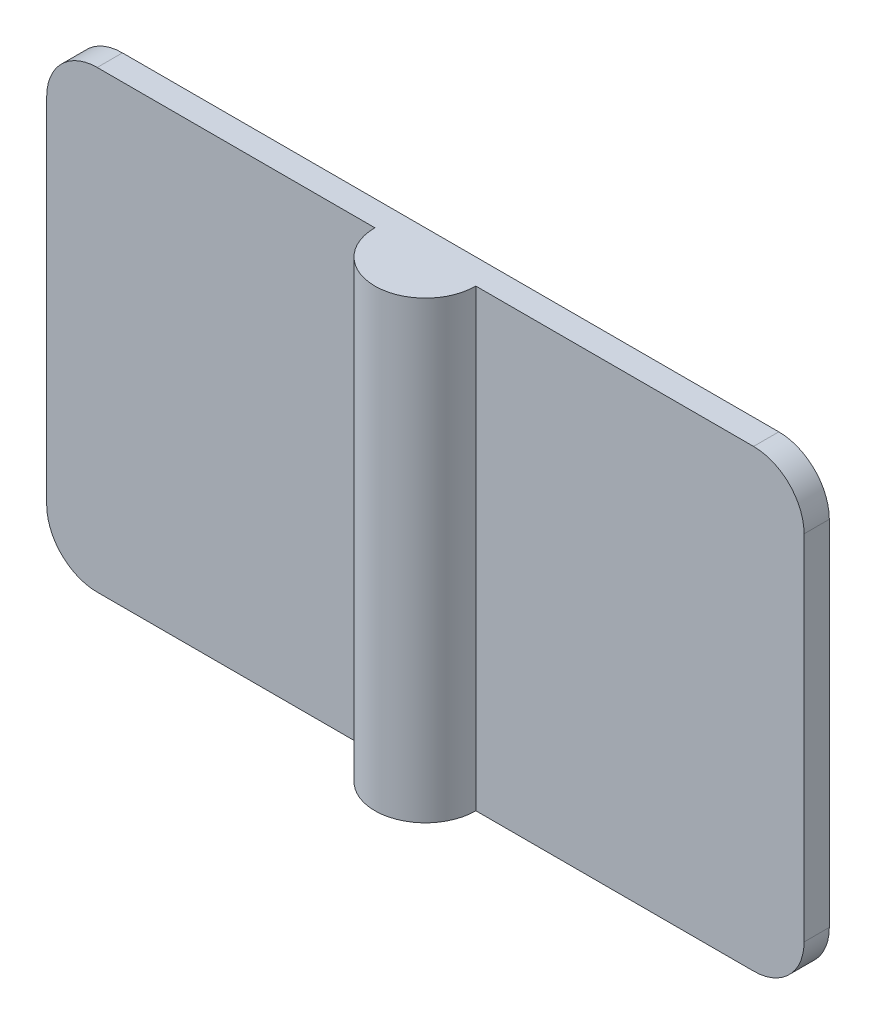
ISO-10303-21;
HEADER;
FILE_DESCRIPTION(('STEP AP214'),'2;1');
FILE_NAME('part.step','',(''),(''),'','','');
FILE_SCHEMA(('AUTOMOTIVE_DESIGN { 1 0 10303 214 1 1 1 1 }'));
ENDSEC;
DATA;
#1=APPLICATION_CONTEXT('core data for automotive mechanical design processes');
#2=APPLICATION_PROTOCOL_DEFINITION('international standard','automotive_design',2000,#1);
#3=PRODUCT_CONTEXT('',#1,'mechanical');
#4=PRODUCT('Part','Part','',(#3));
#5=PRODUCT_RELATED_PRODUCT_CATEGORY('part','',(#4));
#6=PRODUCT_DEFINITION_FORMATION('','',#4);
#7=PRODUCT_DEFINITION_CONTEXT('part definition',#1,'design');
#8=PRODUCT_DEFINITION('design','',#6,#7);
#9=PRODUCT_DEFINITION_SHAPE('','',#8);
#10=(LENGTH_UNIT() NAMED_UNIT(*) SI_UNIT(.MILLI.,.METRE.));
#11=(NAMED_UNIT(*) PLANE_ANGLE_UNIT() SI_UNIT($,.RADIAN.));
#12=(NAMED_UNIT(*) SI_UNIT($,.STERADIAN.) SOLID_ANGLE_UNIT());
#13=UNCERTAINTY_MEASURE_WITH_UNIT(LENGTH_MEASURE(1.E-05),#10,'distance_accuracy_value','');
#14=(GEOMETRIC_REPRESENTATION_CONTEXT(3) GLOBAL_UNCERTAINTY_ASSIGNED_CONTEXT((#13)) GLOBAL_UNIT_ASSIGNED_CONTEXT((#10,
#11,#12)) REPRESENTATION_CONTEXT('',''));
#15=CARTESIAN_POINT('',(0.,0.,0.));
#16=DIRECTION('',(0.,0.,1.));
#17=DIRECTION('',(1.,0.,0.));
#18=AXIS2_PLACEMENT_3D('',#15,#16,#17);
#19=CARTESIAN_POINT('',(0.,0.,1.));
#20=DIRECTION('',(0.,0.,1.));
#21=DIRECTION('',(1.,0.,0.));
#22=AXIS2_PLACEMENT_3D('',#19,#20,#21);
#23=PLANE('',#22);
#24=DIRECTION('',(1.,0.,0.));
#25=VECTOR('',#24,1.);
#26=CARTESIAN_POINT('',(-454.730210404928,-60.9999999999998,1.));
#27=LINE('',#26,#25);
#28=CARTESIAN_POINT('',(-437.730210404928,-60.9999999999998,1.));
#29=VERTEX_POINT('',#28);
#30=CARTESIAN_POINT('',(-426.730210404928,-60.9999999999998,1.));
#31=VERTEX_POINT('',#30);
#32=EDGE_CURVE('E144',#29,#31,#27,.T.);
#33=ORIENTED_EDGE('',*,*,#32,.T.);
#34=CARTESIAN_POINT('',(-426.730210404928,-58.9999999999998,1.));
#35=DIRECTION('',(0.,0.,1.));
#36=DIRECTION('',(1.,0.,0.));
#37=AXIS2_PLACEMENT_3D('',#34,#35,#36);
#38=CIRCLE('',#37,2.);
#39=CARTESIAN_POINT('',(-424.730210404928,-58.9999999999998,1.));
#40=VERTEX_POINT('',#39);
#41=EDGE_CURVE('E11',#31,#40,#38,.T.);
#42=ORIENTED_EDGE('',*,*,#41,.T.);
#43=DIRECTION('',(0.,1.,0.));
#44=VECTOR('',#43,1.);
#45=CARTESIAN_POINT('',(-424.730210404928,-42.9999999999998,1.));
#46=LINE('',#45,#44);
#47=CARTESIAN_POINT('',(-424.730210404928,-44.9999999999998,1.));
#48=VERTEX_POINT('',#47);
#49=EDGE_CURVE('E121',#40,#48,#46,.T.);
#50=ORIENTED_EDGE('',*,*,#49,.T.);
#51=CARTESIAN_POINT('',(-426.730210404928,-44.9999999999998,1.));
#52=DIRECTION('',(0.,0.,1.));
#53=DIRECTION('',(1.,0.,0.));
#54=AXIS2_PLACEMENT_3D('',#51,#52,#53);
#55=CIRCLE('',#54,2.);
#56=CARTESIAN_POINT('',(-426.730210404928,-42.9999999999998,1.));
#57=VERTEX_POINT('',#56);
#58=EDGE_CURVE('E40',#48,#57,#55,.T.);
#59=ORIENTED_EDGE('',*,*,#58,.T.);
#60=DIRECTION('',(-1.,0.,0.));
#61=VECTOR('',#60,1.);
#62=CARTESIAN_POINT('',(-454.730210404928,-42.9999999999998,1.));
#63=LINE('',#62,#61);
#64=CARTESIAN_POINT('',(-437.730210404928,-42.9999999999998,1.));
#65=VERTEX_POINT('',#64);
#66=EDGE_CURVE('E120',#57,#65,#63,.T.);
#67=ORIENTED_EDGE('',*,*,#66,.T.);
#68=DIRECTION('',(0.,1.,0.));
#69=VECTOR('',#68,1.);
#70=CARTESIAN_POINT('',(-437.730210404928,-60.9999999999998,1.));
#71=LINE('',#70,#69);
#72=EDGE_CURVE('E133',#29,#65,#71,.T.);
#73=ORIENTED_EDGE('',*,*,#72,.F.);
#74=EDGE_LOOP('',(#33,#42,#50,#59,#67,#73));
#75=FACE_BOUND('',#74,.T.);
#76=ADVANCED_FACE('F32',(#75),#23,.T.);
#77=CARTESIAN_POINT('',(-454.730210404928,-42.9999999999998,1.));
#78=DIRECTION('',(1.,0.,0.));
#79=DIRECTION('',(0.,0.,-1.));
#80=AXIS2_PLACEMENT_3D('',#77,#78,#79);
#81=PLANE('',#80);
#82=DIRECTION('',(0.,-1.,0.));
#83=VECTOR('',#82,1.);
#84=CARTESIAN_POINT('',(-454.730210404928,-42.9999999999998,0.));
#85=LINE('',#84,#83);
#86=CARTESIAN_POINT('',(-454.730210404928,-44.9999999999998,0.));
#87=VERTEX_POINT('',#86);
#88=CARTESIAN_POINT('',(-454.730210404928,-58.9999999999998,0.));
#89=VERTEX_POINT('',#88);
#90=EDGE_CURVE('E132',#87,#89,#85,.T.);
#91=ORIENTED_EDGE('',*,*,#90,.T.);
#92=DIRECTION('',(0.,0.,-1.));
#93=VECTOR('',#92,1.);
#94=CARTESIAN_POINT('',(-454.730210404928,-58.9999999999998,1.));
#95=LINE('',#94,#93);
#96=CARTESIAN_POINT('',(-454.730210404928,-58.9999999999998,1.));
#97=VERTEX_POINT('',#96);
#98=EDGE_CURVE('E172',#89,#97,#95,.F.);
#99=ORIENTED_EDGE('',*,*,#98,.T.);
#100=DIRECTION('',(0.,-1.,0.));
#101=VECTOR('',#100,1.);
#102=CARTESIAN_POINT('',(-454.730210404928,-42.9999999999998,1.));
#103=LINE('',#102,#101);
#104=CARTESIAN_POINT('',(-454.730210404928,-44.9999999999998,1.));
#105=VERTEX_POINT('',#104);
#106=EDGE_CURVE('E142',#105,#97,#103,.T.);
#107=ORIENTED_EDGE('',*,*,#106,.F.);
#108=DIRECTION('',(0.,0.,-1.));
#109=VECTOR('',#108,1.);
#110=CARTESIAN_POINT('',(-454.730210404928,-44.9999999999998,1.));
#111=LINE('',#110,#109);
#112=EDGE_CURVE('E169',#105,#87,#111,.T.);
#113=ORIENTED_EDGE('',*,*,#112,.T.);
#114=EDGE_LOOP('',(#91,#99,#107,#113));
#115=FACE_BOUND('',#114,.T.);
#116=ADVANCED_FACE('F208',(#115),#81,.F.);
#117=CARTESIAN_POINT('',(-454.730210404928,-60.9999999999998,1.));
#118=DIRECTION('',(0.,1.,0.));
#119=DIRECTION('',(0.,0.,1.));
#120=AXIS2_PLACEMENT_3D('',#117,#118,#119);
#121=PLANE('',#120);
#122=CARTESIAN_POINT('',(-452.730210404928,-60.9999999999998,1.));
#123=VERTEX_POINT('',#122);
#124=CARTESIAN_POINT('',(-441.730210404928,-60.9999999999998,1.));
#125=VERTEX_POINT('',#124);
#126=EDGE_CURVE('E128',#123,#125,#27,.T.);
#127=ORIENTED_EDGE('',*,*,#126,.F.);
#128=DIRECTION('',(0.,0.,-1.));
#129=VECTOR('',#128,1.);
#130=CARTESIAN_POINT('',(-452.730210404928,-60.9999999999998,1.));
#131=LINE('',#130,#129);
#132=CARTESIAN_POINT('',(-452.730210404928,-60.9999999999998,0.));
#133=VERTEX_POINT('',#132);
#134=EDGE_CURVE('E158',#123,#133,#131,.T.);
#135=ORIENTED_EDGE('',*,*,#134,.T.);
#136=DIRECTION('',(1.,0.,0.));
#137=VECTOR('',#136,1.);
#138=CARTESIAN_POINT('',(-454.730210404928,-60.9999999999998,0.));
#139=LINE('',#138,#137);
#140=CARTESIAN_POINT('',(-426.730210404928,-60.9999999999998,0.));
#141=VERTEX_POINT('',#140);
#142=EDGE_CURVE('E151',#133,#141,#139,.T.);
#143=ORIENTED_EDGE('',*,*,#142,.T.);
#144=DIRECTION('',(0.,0.,-1.));
#145=VECTOR('',#144,1.);
#146=CARTESIAN_POINT('',(-426.730210404928,-60.9999999999998,1.));
#147=LINE('',#146,#145);
#148=EDGE_CURVE('E148',#141,#31,#147,.F.);
#149=ORIENTED_EDGE('',*,*,#148,.T.);
#150=ORIENTED_EDGE('',*,*,#32,.F.);
#151=CARTESIAN_POINT('',(-439.730210404928,-60.9999999999998,1.));
#152=DIRECTION('',(0.,1.,0.));
#153=DIRECTION('',(0.,0.,1.));
#154=AXIS2_PLACEMENT_3D('',#151,#152,#153);
#155=CIRCLE('',#154,2.);
#156=EDGE_CURVE('E137',#125,#29,#155,.T.);
#157=ORIENTED_EDGE('',*,*,#156,.F.);
#158=EDGE_LOOP('',(#127,#135,#143,#149,#150,#157));
#159=FACE_BOUND('',#158,.T.);
#160=ADVANCED_FACE('F199',(#159),#121,.F.);
#161=CARTESIAN_POINT('',(-424.730210404928,-42.9999999999998,1.));
#162=DIRECTION('',(-1.,0.,0.));
#163=DIRECTION('',(0.,0.,1.));
#164=AXIS2_PLACEMENT_3D('',#161,#162,#163);
#165=PLANE('',#164);
#166=ORIENTED_EDGE('',*,*,#49,.F.);
#167=DIRECTION('',(0.,0.,-1.));
#168=VECTOR('',#167,1.);
#169=CARTESIAN_POINT('',(-424.730210404928,-58.9999999999998,1.));
#170=LINE('',#169,#168);
#171=CARTESIAN_POINT('',(-424.730210404928,-58.9999999999998,0.));
#172=VERTEX_POINT('',#171);
#173=EDGE_CURVE('E183',#40,#172,#170,.T.);
#174=ORIENTED_EDGE('',*,*,#173,.T.);
#175=DIRECTION('',(0.,1.,0.));
#176=VECTOR('',#175,1.);
#177=CARTESIAN_POINT('',(-424.730210404928,-42.9999999999998,0.));
#178=LINE('',#177,#176);
#179=CARTESIAN_POINT('',(-424.730210404928,-44.9999999999998,0.));
#180=VERTEX_POINT('',#179);
#181=EDGE_CURVE('E154',#172,#180,#178,.T.);
#182=ORIENTED_EDGE('',*,*,#181,.T.);
#183=DIRECTION('',(0.,0.,-1.));
#184=VECTOR('',#183,1.);
#185=CARTESIAN_POINT('',(-424.730210404928,-44.9999999999998,1.));
#186=LINE('',#185,#184);
#187=EDGE_CURVE('E47',#180,#48,#186,.F.);
#188=ORIENTED_EDGE('',*,*,#187,.T.);
#189=EDGE_LOOP('',(#166,#174,#182,#188));
#190=FACE_BOUND('',#189,.T.);
#191=ADVANCED_FACE('F193',(#190),#165,.F.);
#192=CARTESIAN_POINT('',(-454.730210404928,-42.9999999999998,1.));
#193=DIRECTION('',(0.,-1.,0.));
#194=DIRECTION('',(0.,0.,-1.));
#195=AXIS2_PLACEMENT_3D('',#192,#193,#194);
#196=PLANE('',#195);
#197=DIRECTION('',(-1.,0.,0.));
#198=VECTOR('',#197,1.);
#199=CARTESIAN_POINT('',(-454.730210404928,-42.9999999999998,0.));
#200=LINE('',#199,#198);
#201=CARTESIAN_POINT('',(-426.730210404928,-42.9999999999998,0.));
#202=VERTEX_POINT('',#201);
#203=CARTESIAN_POINT('',(-452.730210404928,-42.9999999999998,0.));
#204=VERTEX_POINT('',#203);
#205=EDGE_CURVE('E145',#202,#204,#200,.T.);
#206=ORIENTED_EDGE('',*,*,#205,.T.);
#207=DIRECTION('',(0.,0.,-1.));
#208=VECTOR('',#207,1.);
#209=CARTESIAN_POINT('',(-452.730210404928,-42.9999999999998,1.));
#210=LINE('',#209,#208);
#211=CARTESIAN_POINT('',(-452.730210404928,-42.9999999999998,1.));
#212=VERTEX_POINT('',#211);
#213=EDGE_CURVE('E117',#204,#212,#210,.F.);
#214=ORIENTED_EDGE('',*,*,#213,.T.);
#215=CARTESIAN_POINT('',(-441.730210404928,-42.9999999999998,1.));
#216=VERTEX_POINT('',#215);
#217=EDGE_CURVE('E109',#216,#212,#63,.T.);
#218=ORIENTED_EDGE('',*,*,#217,.F.);
#219=CARTESIAN_POINT('',(-439.730210404928,-42.9999999999998,1.));
#220=DIRECTION('',(0.,1.,0.));
#221=DIRECTION('',(0.,0.,1.));
#222=AXIS2_PLACEMENT_3D('',#219,#220,#221);
#223=CIRCLE('',#222,2.);
#224=EDGE_CURVE('E115',#216,#65,#223,.T.);
#225=ORIENTED_EDGE('',*,*,#224,.T.);
#226=ORIENTED_EDGE('',*,*,#66,.F.);
#227=DIRECTION('',(0.,0.,-1.));
#228=VECTOR('',#227,1.);
#229=CARTESIAN_POINT('',(-426.730210404928,-42.9999999999998,1.));
#230=LINE('',#229,#228);
#231=EDGE_CURVE('E178',#57,#202,#230,.T.);
#232=ORIENTED_EDGE('',*,*,#231,.T.);
#233=EDGE_LOOP('',(#206,#214,#218,#225,#226,#232));
#234=FACE_BOUND('',#233,.T.);
#235=ADVANCED_FACE('F112',(#234),#196,.F.);
#236=ORIENTED_EDGE('',*,*,#106,.T.);
#237=CARTESIAN_POINT('',(-452.730210404928,-58.9999999999998,1.));
#238=DIRECTION('',(0.,0.,1.));
#239=DIRECTION('',(1.,0.,0.));
#240=AXIS2_PLACEMENT_3D('',#237,#238,#239);
#241=CIRCLE('',#240,2.);
#242=EDGE_CURVE('E176',#97,#123,#241,.T.);
#243=ORIENTED_EDGE('',*,*,#242,.T.);
#244=ORIENTED_EDGE('',*,*,#126,.T.);
#245=DIRECTION('',(0.,1.,0.));
#246=VECTOR('',#245,1.);
#247=CARTESIAN_POINT('',(-441.730210404928,-60.9999999999998,1.));
#248=LINE('',#247,#246);
#249=EDGE_CURVE('E124',#125,#216,#248,.T.);
#250=ORIENTED_EDGE('',*,*,#249,.T.);
#251=ORIENTED_EDGE('',*,*,#217,.T.);
#252=CARTESIAN_POINT('',(-452.730210404928,-44.9999999999998,1.));
#253=DIRECTION('',(0.,0.,1.));
#254=DIRECTION('',(1.,0.,0.));
#255=AXIS2_PLACEMENT_3D('',#252,#253,#254);
#256=CIRCLE('',#255,2.);
#257=EDGE_CURVE('E174',#212,#105,#256,.T.);
#258=ORIENTED_EDGE('',*,*,#257,.T.);
#259=EDGE_LOOP('',(#236,#243,#244,#250,#251,#258));
#260=FACE_BOUND('',#259,.T.);
#261=ADVANCED_FACE('F126',(#260),#23,.T.);
#262=CARTESIAN_POINT('',(0.,0.,0.));
#263=DIRECTION('',(0.,0.,1.));
#264=DIRECTION('',(1.,0.,0.));
#265=AXIS2_PLACEMENT_3D('',#262,#263,#264);
#266=PLANE('',#265);
#267=ORIENTED_EDGE('',*,*,#142,.F.);
#268=CARTESIAN_POINT('',(-452.730210404928,-58.9999999999998,0.));
#269=DIRECTION('',(0.,0.,1.));
#270=DIRECTION('',(1.,0.,0.));
#271=AXIS2_PLACEMENT_3D('',#268,#269,#270);
#272=CIRCLE('',#271,2.);
#273=EDGE_CURVE('E167',#133,#89,#272,.F.);
#274=ORIENTED_EDGE('',*,*,#273,.T.);
#275=ORIENTED_EDGE('',*,*,#90,.F.);
#276=CARTESIAN_POINT('',(-452.730210404928,-44.9999999999998,0.));
#277=DIRECTION('',(0.,0.,1.));
#278=DIRECTION('',(1.,0.,0.));
#279=AXIS2_PLACEMENT_3D('',#276,#277,#278);
#280=CIRCLE('',#279,2.);
#281=EDGE_CURVE('E165',#87,#204,#280,.F.);
#282=ORIENTED_EDGE('',*,*,#281,.T.);
#283=ORIENTED_EDGE('',*,*,#205,.F.);
#284=CARTESIAN_POINT('',(-426.730210404928,-44.9999999999998,0.));
#285=DIRECTION('',(0.,0.,1.));
#286=DIRECTION('',(1.,0.,0.));
#287=AXIS2_PLACEMENT_3D('',#284,#285,#286);
#288=CIRCLE('',#287,2.);
#289=EDGE_CURVE('E161',#202,#180,#288,.F.);
#290=ORIENTED_EDGE('',*,*,#289,.T.);
#291=ORIENTED_EDGE('',*,*,#181,.F.);
#292=CARTESIAN_POINT('',(-426.730210404928,-58.9999999999998,0.));
#293=DIRECTION('',(0.,0.,1.));
#294=DIRECTION('',(1.,0.,0.));
#295=AXIS2_PLACEMENT_3D('',#292,#293,#294);
#296=CIRCLE('',#295,2.);
#297=EDGE_CURVE('E163',#172,#141,#296,.F.);
#298=ORIENTED_EDGE('',*,*,#297,.T.);
#299=EDGE_LOOP('',(#267,#274,#275,#282,#283,#290,#291,#298));
#300=FACE_BOUND('',#299,.T.);
#301=ADVANCED_FACE('F192',(#300),#266,.F.);
#302=CARTESIAN_POINT('',(-439.730210404928,-60.9999999999998,1.));
#303=DIRECTION('',(0.,1.,0.));
#304=DIRECTION('',(0.,0.,1.));
#305=AXIS2_PLACEMENT_3D('',#302,#303,#304);
#306=CYLINDRICAL_SURFACE('',#305,2.);
#307=ORIENTED_EDGE('',*,*,#224,.F.);
#308=ORIENTED_EDGE('',*,*,#249,.F.);
#309=ORIENTED_EDGE('',*,*,#156,.T.);
#310=ORIENTED_EDGE('',*,*,#72,.T.);
#311=EDGE_LOOP('',(#307,#308,#309,#310));
#312=FACE_BOUND('',#311,.T.);
#313=ADVANCED_FACE('F136',(#312),#306,.T.);
#314=CARTESIAN_POINT('',(-452.730210404928,-58.9999999999998,1.));
#315=DIRECTION('',(0.,0.,-1.));
#316=DIRECTION('',(-1.,0.,0.));
#317=AXIS2_PLACEMENT_3D('',#314,#315,#316);
#318=CYLINDRICAL_SURFACE('',#317,2.);
#319=ORIENTED_EDGE('',*,*,#242,.F.);
#320=ORIENTED_EDGE('',*,*,#98,.F.);
#321=ORIENTED_EDGE('',*,*,#273,.F.);
#322=ORIENTED_EDGE('',*,*,#134,.F.);
#323=EDGE_LOOP('',(#319,#320,#321,#322));
#324=FACE_BOUND('',#323,.T.);
#325=ADVANCED_FACE('F204',(#324),#318,.T.);
#326=CARTESIAN_POINT('',(-452.730210404928,-44.9999999999998,1.));
#327=DIRECTION('',(0.,0.,-1.));
#328=DIRECTION('',(-1.,0.,0.));
#329=AXIS2_PLACEMENT_3D('',#326,#327,#328);
#330=CYLINDRICAL_SURFACE('',#329,2.);
#331=ORIENTED_EDGE('',*,*,#257,.F.);
#332=ORIENTED_EDGE('',*,*,#213,.F.);
#333=ORIENTED_EDGE('',*,*,#281,.F.);
#334=ORIENTED_EDGE('',*,*,#112,.F.);
#335=EDGE_LOOP('',(#331,#332,#333,#334));
#336=FACE_BOUND('',#335,.T.);
#337=ADVANCED_FACE('F212',(#336),#330,.T.);
#338=CARTESIAN_POINT('',(-426.730210404928,-58.9999999999998,1.));
#339=DIRECTION('',(0.,0.,-1.));
#340=DIRECTION('',(-1.,0.,0.));
#341=AXIS2_PLACEMENT_3D('',#338,#339,#340);
#342=CYLINDRICAL_SURFACE('',#341,2.);
#343=ORIENTED_EDGE('',*,*,#41,.F.);
#344=ORIENTED_EDGE('',*,*,#148,.F.);
#345=ORIENTED_EDGE('',*,*,#297,.F.);
#346=ORIENTED_EDGE('',*,*,#173,.F.);
#347=EDGE_LOOP('',(#343,#344,#345,#346));
#348=FACE_BOUND('',#347,.T.);
#349=ADVANCED_FACE('F196',(#348),#342,.T.);
#350=CARTESIAN_POINT('',(-426.730210404928,-44.9999999999998,1.));
#351=DIRECTION('',(0.,0.,-1.));
#352=DIRECTION('',(-1.,0.,0.));
#353=AXIS2_PLACEMENT_3D('',#350,#351,#352);
#354=CYLINDRICAL_SURFACE('',#353,2.);
#355=ORIENTED_EDGE('',*,*,#58,.F.);
#356=ORIENTED_EDGE('',*,*,#187,.F.);
#357=ORIENTED_EDGE('',*,*,#289,.F.);
#358=ORIENTED_EDGE('',*,*,#231,.F.);
#359=EDGE_LOOP('',(#355,#356,#357,#358));
#360=FACE_BOUND('',#359,.T.);
#361=ADVANCED_FACE('F34',(#360),#354,.T.);
#362=CLOSED_SHELL('',(#76,#116,#160,#191,#235,#261,#301,#313,#325,#337,#349,#361));
#363=MANIFOLD_SOLID_BREP('B2',#362);
#364=ADVANCED_BREP_SHAPE_REPRESENTATION('',(#18,#363),#14);
#365=SHAPE_DEFINITION_REPRESENTATION(#9,#364);
ENDSEC;
END-ISO-10303-21;
